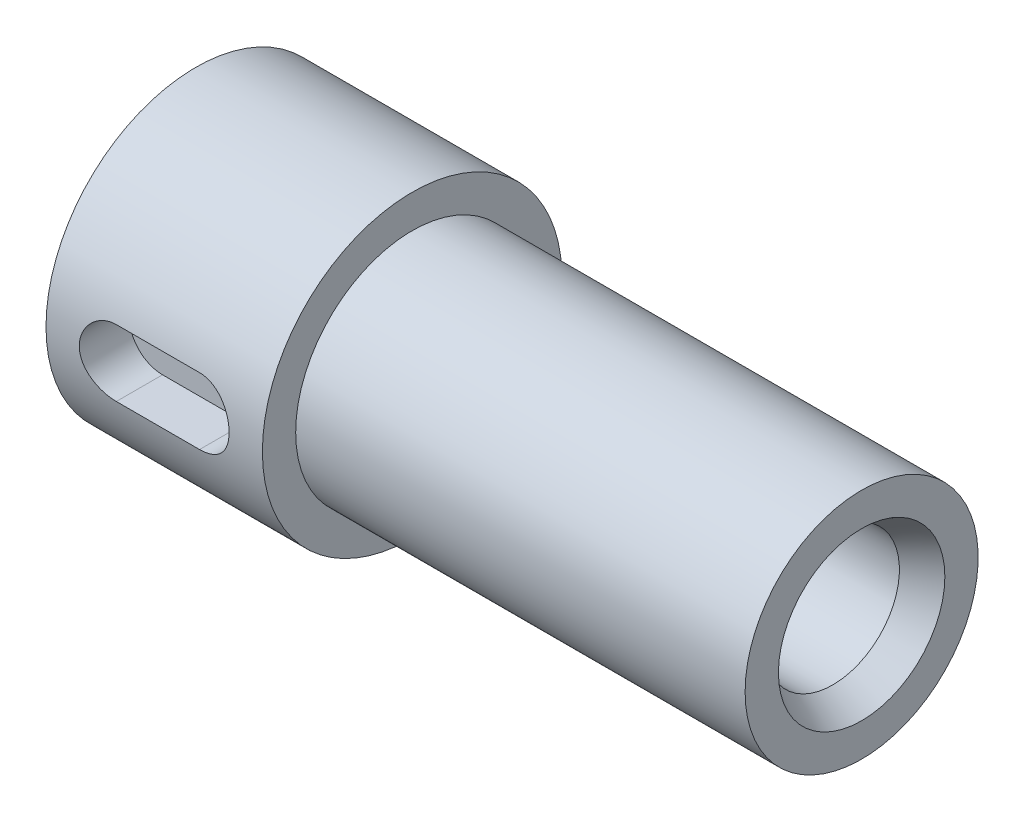
ISO-10303-21;
HEADER;
FILE_DESCRIPTION(('STEP AP214'),'2;1');
FILE_NAME('part.step','',(''),(''),'','','');
FILE_SCHEMA(('AUTOMOTIVE_DESIGN { 1 0 10303 214 1 1 1 1 }'));
ENDSEC;
DATA;
#1=APPLICATION_CONTEXT('core data for automotive mechanical design processes');
#2=APPLICATION_PROTOCOL_DEFINITION('international standard','automotive_design',2000,#1);
#3=PRODUCT_CONTEXT('',#1,'mechanical');
#4=PRODUCT('Part','Part','',(#3));
#5=PRODUCT_RELATED_PRODUCT_CATEGORY('part','',(#4));
#6=PRODUCT_DEFINITION_FORMATION('','',#4);
#7=PRODUCT_DEFINITION_CONTEXT('part definition',#1,'design');
#8=PRODUCT_DEFINITION('design','',#6,#7);
#9=PRODUCT_DEFINITION_SHAPE('','',#8);
#10=(LENGTH_UNIT() NAMED_UNIT(*) SI_UNIT(.MILLI.,.METRE.));
#11=(NAMED_UNIT(*) PLANE_ANGLE_UNIT() SI_UNIT($,.RADIAN.));
#12=(NAMED_UNIT(*) SI_UNIT($,.STERADIAN.) SOLID_ANGLE_UNIT());
#13=UNCERTAINTY_MEASURE_WITH_UNIT(LENGTH_MEASURE(1.E-05),#10,'distance_accuracy_value','');
#14=(GEOMETRIC_REPRESENTATION_CONTEXT(3) GLOBAL_UNCERTAINTY_ASSIGNED_CONTEXT((#13)) GLOBAL_UNIT_ASSIGNED_CONTEXT((#10,
#11,#12)) REPRESENTATION_CONTEXT('',''));
#15=CARTESIAN_POINT('',(0.,0.,0.));
#16=DIRECTION('',(0.,0.,1.));
#17=DIRECTION('',(1.,0.,0.));
#18=AXIS2_PLACEMENT_3D('',#15,#16,#17);
#19=CARTESIAN_POINT('',(0.,5.,0.));
#20=DIRECTION('',(1.,0.,0.));
#21=DIRECTION('',(0.,0.,-1.));
#22=AXIS2_PLACEMENT_3D('',#19,#20,#21);
#23=PLANE('',#22);
#24=CARTESIAN_POINT('',(0.,0.,0.));
#25=DIRECTION('',(-1.,0.,0.));
#26=DIRECTION('',(0.,0.,1.));
#27=AXIS2_PLACEMENT_3D('',#24,#25,#26);
#28=CIRCLE('',#27,5.);
#29=CARTESIAN_POINT('',(0.,0.,5.));
#30=VERTEX_POINT('',#29);
#31=EDGE_CURVE('E139',#30,#30,#28,.T.);
#32=ORIENTED_EDGE('',*,*,#31,.F.);
#33=EDGE_LOOP('',(#32));
#34=FACE_BOUND('',#33,.T.);
#35=CARTESIAN_POINT('',(0.,0.,0.));
#36=DIRECTION('',(-1.,0.,0.));
#37=DIRECTION('',(0.,0.,1.));
#38=AXIS2_PLACEMENT_3D('',#35,#36,#37);
#39=CIRCLE('',#38,9.);
#40=CARTESIAN_POINT('',(0.,0.,9.));
#41=VERTEX_POINT('',#40);
#42=EDGE_CURVE('E175',#41,#41,#39,.T.);
#43=ORIENTED_EDGE('',*,*,#42,.T.);
#44=EDGE_LOOP('',(#43));
#45=FACE_BOUND('',#44,.T.);
#46=ADVANCED_FACE('F45',(#34,#45),#23,.F.);
#47=CARTESIAN_POINT('',(-23.3569219883822,0.,0.));
#48=DIRECTION('',(-1.,0.,0.));
#49=DIRECTION('',(0.,0.,1.));
#50=AXIS2_PLACEMENT_3D('',#47,#48,#49);
#51=CYLINDRICAL_SURFACE('',#50,9.);
#52=CARTESIAN_POINT('',(1.75833325536159,-2.14292396089153,-8.74115993153714));
#53=CARTESIAN_POINT('',(1.91188925583367,-2.26148327559426,-8.71209627188879));
#54=CARTESIAN_POINT('',(2.0763003689229,-2.36665921541542,-8.6837679993605));
#55=CARTESIAN_POINT('',(2.42111145111499,-2.54891187907728,-8.63203868608792));
#56=CARTESIAN_POINT('',(2.60155974831889,-2.62589982629616,-8.608653308841));
#57=CARTESIAN_POINT('',(2.97406287405361,-2.75096916279531,-8.56950957572126));
#58=CARTESIAN_POINT('',(3.16617214374473,-2.79890130458627,-8.55379067864858));
#59=CARTESIAN_POINT('',(3.55583528421908,-2.86452531710483,-8.53203967543747));
#60=CARTESIAN_POINT('',(3.7533845555291,-2.88224198260962,-8.52599962709561));
#61=CARTESIAN_POINT('',(4.1564867882038,-2.88733647052554,-8.52427796279432));
#62=CARTESIAN_POINT('',(4.36205766833457,-2.87353150975853,-8.52900016541797));
#63=CARTESIAN_POINT('',(4.7679136276992,-2.81333602787432,-8.54904239202166));
#64=CARTESIAN_POINT('',(4.96819670738671,-2.76693335820623,-8.5643663670499));
#65=CARTESIAN_POINT('',(5.35786606668187,-2.6421733800478,-8.60367266678249));
#66=CARTESIAN_POINT('',(5.54724289250433,-2.5637888108962,-8.62766237596101));
#67=CARTESIAN_POINT('',(5.90924644812142,-2.37592236980096,-8.6812732764871));
#68=CARTESIAN_POINT('',(6.08186496486539,-2.26642535220534,-8.71089720826652));
#69=CARTESIAN_POINT('',(6.39921938212463,-2.02116158582223,-8.7709966264416));
#70=CARTESIAN_POINT('',(6.54461436645699,-1.88624084930456,-8.80142312488864));
#71=CARTESIAN_POINT('',(6.80630945836137,-1.59023987463746,-8.85966638393269));
#72=CARTESIAN_POINT('',(6.92267456436015,-1.42921943349234,-8.88748888596807));
#73=CARTESIAN_POINT('',(7.09032172911989,-1.1346399141352,-8.92905089652476));
#74=CARTESIAN_POINT('',(7.15069752889299,-1.00647065905311,-8.94454027564996));
#75=CARTESIAN_POINT('',(7.24982617675971,-0.74153073937674,-8.97038342542183));
#76=CARTESIAN_POINT('',(7.28859712763936,-0.604767383072859,-8.98074149480239));
#77=CARTESIAN_POINT('',(7.34237135980943,-0.325711753990555,-8.9951926599674));
#78=CARTESIAN_POINT('',(7.35728034749992,-0.183399811629303,-8.99926089853954));
#79=CARTESIAN_POINT('',(7.36203724693521,0.101680920708592,-9.00055360119157));
#80=CARTESIAN_POINT('',(7.35188675666207,0.244449680975271,-8.99777850165451));
#81=CARTESIAN_POINT('',(7.30866366043605,0.516747809595217,-8.98612134770257));
#82=CARTESIAN_POINT('',(7.27710026141727,0.646539590229844,-8.97764166931983));
#83=CARTESIAN_POINT('',(7.1943510641809,0.89923966655062,-8.95586235240603));
#84=CARTESIAN_POINT('',(7.14316194635,1.02214679369159,-8.94256189848049));
#85=CARTESIAN_POINT('',(7.02014747632733,1.26523401330787,-8.91151143721175));
#86=CARTESIAN_POINT('',(6.94733528857277,1.38488504607174,-8.89355560747465));
#87=CARTESIAN_POINT('',(6.78531701470174,1.61203740337076,-8.85520366907802));
#88=CARTESIAN_POINT('',(6.69610350647156,1.71953319156203,-8.83480645708029));
#89=CARTESIAN_POINT('',(6.48969372130638,1.93628500493332,-8.79004052171071));
#90=CARTESIAN_POINT('',(6.37030908844286,2.04342628698857,-8.76553222208635));
#91=CARTESIAN_POINT('',(6.1170954900999,2.23927563762538,-8.71755858719134));
#92=CARTESIAN_POINT('',(5.98325762984667,2.32797225567665,-8.69409390686687));
#93=CARTESIAN_POINT('',(5.68262828519094,2.49857951712768,-8.64674138014602));
#94=CARTESIAN_POINT('',(5.51394468199514,2.57730644128964,-8.62335187318785));
#95=CARTESIAN_POINT('',(5.16594153076588,2.70854883689283,-8.58303455692452));
#96=CARTESIAN_POINT('',(4.98661806071184,2.7610545747915,-8.56610914769881));
#97=CARTESIAN_POINT('',(4.60634190610235,2.8425028183176,-8.53945028845981));
#98=CARTESIAN_POINT('',(4.40483372542499,2.86911071945456,-8.53043568244742));
#99=CARTESIAN_POINT('',(3.99995507467814,2.89037242349216,-8.52325464914076));
#100=CARTESIAN_POINT('',(3.79658449188051,2.88502427921015,-8.52508888290045));
#101=CARTESIAN_POINT('',(3.39073895693245,2.84216725153015,-8.53947314548294));
#102=CARTESIAN_POINT('',(3.18831672692417,2.8042076009808,-8.55217335731852));
#103=CARTESIAN_POINT('',(2.79297081580028,2.69608239512659,-8.58687007959057));
#104=CARTESIAN_POINT('',(2.60005202984891,2.62590043046981,-8.60887132616612));
#105=CARTESIAN_POINT('',(2.2301103569024,2.4544842419347,-8.65929857481296));
#106=CARTESIAN_POINT('',(2.05304221140792,2.35334232780968,-8.68770541263615));
#107=CARTESIAN_POINT('',(1.72036773621613,2.12104857138793,-8.74731182908649));
#108=CARTESIAN_POINT('',(1.56473747551387,1.98993063343339,-8.77850822849513));
#109=CARTESIAN_POINT('',(1.31365516989232,1.73202856721591,-8.83251480966215));
#110=CARTESIAN_POINT('',(1.21252716676674,1.61082426178729,-8.85564110429793));
#111=CARTESIAN_POINT('',(1.03137188335381,1.35297758400223,-8.89867889646532));
#112=CARTESIAN_POINT('',(0.951331291992842,1.21634502866907,-8.91859241891283));
#113=CARTESIAN_POINT('',(0.815994872071757,0.929292927898268,-8.95306777969438));
#114=CARTESIAN_POINT('',(0.760888352438434,0.778778018221064,-8.9675885299273));
#115=CARTESIAN_POINT('',(0.680178766689468,0.469514966187441,-8.98907499277886));
#116=CARTESIAN_POINT('',(0.654548649862884,0.310774512537897,-8.9960476320086));
#117=CARTESIAN_POINT('',(0.636063062611368,0.0120112048836093,-9.00106937182501));
#118=CARTESIAN_POINT('',(0.639387416248763,-0.12776858316566,-9.00015868530705));
#119=CARTESIAN_POINT('',(0.669624004534528,-0.40452176718807,-8.9919692319703));
#120=CARTESIAN_POINT('',(0.696530890963053,-0.541495792265256,-8.98469190902471));
#121=CARTESIAN_POINT('',(0.770876710003022,-0.803737800758477,-8.96497015086287));
#122=CARTESIAN_POINT('',(0.817514852240793,-0.929251682867247,-8.95272794294313));
#123=CARTESIAN_POINT('',(0.928915715765842,-1.171502604322,-8.92426373509219));
#124=CARTESIAN_POINT('',(0.993691212482553,-1.28823338330634,-8.90803893093235));
#125=CARTESIAN_POINT('',(1.14610192018282,-1.52217606529092,-8.8712110222053));
#126=CARTESIAN_POINT('',(1.23537440899097,-1.63827093737495,-8.8503324431217));
#127=CARTESIAN_POINT('',(1.42950685158114,-1.85600876762425,-8.80724409863128));
#128=CARTESIAN_POINT('',(1.5343458641296,-1.95767078793829,-8.78503614519046));
#129=CARTESIAN_POINT('',(1.68240154392511,-2.08294348133556,-8.7557051798239));
#130=CARTESIAN_POINT('',(1.72002968549345,-2.1133500922034,-8.74840967700161));
#131=CARTESIAN_POINT('',(1.75833325536159,-2.14292396089153,-8.74115993153714));
#132=B_SPLINE_CURVE_WITH_KNOTS('',3,(#52,#53,#54,#55,#56,#57,#58,#59,#60,#61,#62,#63,#64,#65,
#66,#67,#68,#69,#70,#71,#72,#73,#74,#75,#76,#77,#78,#79,#80,#81,#82,#83,#84,#85,#86,#87,#88,#89,
#90,#91,#92,#93,#94,#95,#96,#97,#98,#99,#100,#101,#102,#103,#104,#105,#106,#107,#108,#109,#110,
#111,#112,#113,#114,#115,#116,#117,#118,#119,#120,#121,#122,#123,#124,#125,#126,#127,#128,#129,
#130,#131),.UNSPECIFIED.,.T.,.F.,(4,2,2,2,2,2,2,2,2,2,2,2,2,2,2,2,2,2,2,2,2,2,2,2,2,2,2,2,2,2,2,
2,2,2,2,2,2,2,2,4),(0.,0.588366491328109,1.17857038933175,1.77178078073522,2.3645041498911,
2.97983189325426,3.5953890793953,4.21147205260222,4.82785545256052,5.42651307214421,
6.02381800707726,6.44962159245994,6.87506785682788,7.30219121217525,7.72928733160694,
8.12903845304253,8.52885722066378,8.95084454050468,9.37302329505726,9.85797411606963,
10.3432251038467,10.9037035386571,11.4643898737908,12.0719107107321,12.6794685662119,
13.2955619358445,13.9119694022733,14.5265566090221,15.1404520969251,15.6171555927479,
16.0935574526129,16.5735180198928,17.0530377714839,17.4703554338164,17.8875784782692,
18.2892852056969,18.6912755986404,19.1334269588619,19.5749888051622,19.7217530927145),.UNSPECIFIED.);
#133=CARTESIAN_POINT('',(1.75833325536159,-2.14292396089153,-8.74115993153714));
#134=VERTEX_POINT('',#133);
#135=EDGE_CURVE('E11',#134,#134,#132,.T.);
#136=ORIENTED_EDGE('',*,*,#135,.T.);
#137=EDGE_LOOP('',(#136));
#138=FACE_BOUND('',#137,.T.);
#139=DIRECTION('',(-1.,0.,0.));
#140=VECTOR('',#139,1.);
#141=CARTESIAN_POINT('',(-23.3569219883822,2.,8.77496438739212));
#142=LINE('',#141,#140);
#143=CARTESIAN_POINT('',(4.,2.,8.77496438739212));
#144=VERTEX_POINT('',#143);
#145=CARTESIAN_POINT('',(9.,2.,8.77496438739212));
#146=VERTEX_POINT('',#145);
#147=EDGE_CURVE('E57',#144,#146,#142,.F.);
#148=ORIENTED_EDGE('',*,*,#147,.T.);
#149=CARTESIAN_POINT('',(9.,2.,8.77496438739212));
#150=CARTESIAN_POINT('',(9.05552514647361,2.00000045459512,8.77496115640034));
#151=CARTESIAN_POINT('',(9.11102298474512,1.99768624944103,8.77549207584912));
#152=CARTESIAN_POINT('',(9.22160754178049,1.98845937411262,8.77758865304998));
#153=CARTESIAN_POINT('',(9.27669431784451,1.98154735743532,8.77915416375314));
#154=CARTESIAN_POINT('',(9.44054306407064,1.95400762017603,8.78534175721998));
#155=CARTESIAN_POINT('',(9.54818536469855,1.92657583620863,8.79145524574102));
#156=CARTESIAN_POINT('',(9.75718934192003,1.85442890808307,8.80695386197933));
#157=CARTESIAN_POINT('',(9.85855085705957,1.80971331984064,8.81633907375855));
#158=CARTESIAN_POINT('',(10.0523726932893,1.70431160656546,8.83731858728191));
#159=CARTESIAN_POINT('',(10.1448314742125,1.6436227249196,8.84891327023316));
#160=CARTESIAN_POINT('',(10.3197805511644,1.50688367246421,8.87322853498742));
#161=CARTESIAN_POINT('',(10.402093755033,1.4306095964124,8.88596380452778));
#162=CARTESIAN_POINT('',(10.5528770661474,1.26534059716698,8.91099808649458));
#163=CARTESIAN_POINT('',(10.6213450042461,1.17634368440047,8.92329703031307));
#164=CARTESIAN_POINT('',(10.7431924634024,0.98696143799893,8.94623322919261));
#165=CARTESIAN_POINT('',(10.7964000694536,0.886462933944573,8.95685099014158));
#166=CARTESIAN_POINT('',(10.8851016409907,0.677680651993802,8.97506064392737));
#167=CARTESIAN_POINT('',(10.9205985854612,0.56939818689005,8.98265304559509));
#168=CARTESIAN_POINT('',(10.9723131458297,0.349972042707733,8.99385278070445));
#169=CARTESIAN_POINT('',(10.9888327350002,0.23890276933789,8.99752246602341));
#170=CARTESIAN_POINT('',(11.0030683194609,0.0155102254995511,9.00067950054334));
#171=CARTESIAN_POINT('',(11.000786104026,-0.0968129246277485,9.00016724771875));
#172=CARTESIAN_POINT('',(10.9777062341623,-0.317436362044324,8.9950654834089));
#173=CARTESIAN_POINT('',(10.9572345634269,-0.425772656175102,8.99054775932266));
#174=CARTESIAN_POINT('',(10.8988770204773,-0.637431676318211,8.97802470899415));
#175=CARTESIAN_POINT('',(10.8609904840198,-0.740754210927917,8.97001924972218));
#176=CARTESIAN_POINT('',(10.7685923943718,-0.940355194441152,8.95130525177461));
#177=CARTESIAN_POINT('',(10.7139578341858,-1.03657475960066,8.94057681784342));
#178=CARTESIAN_POINT('',(10.5897078064752,-1.21859559658287,8.91759236806566));
#179=CARTESIAN_POINT('',(10.5200906630081,-1.3043957012102,8.90533618139019));
#180=CARTESIAN_POINT('',(10.3660897498953,-1.46507502998867,8.88033319867523));
#181=CARTESIAN_POINT('',(10.2814223440611,-1.53968185784836,8.86758151505484));
#182=CARTESIAN_POINT('',(10.1006192889536,-1.67370851020907,8.84326607482464));
#183=CARTESIAN_POINT('',(10.004480510531,-1.73312417692636,8.83170264395353));
#184=CARTESIAN_POINT('',(9.80299870610474,-1.83521144407732,8.81105737294632));
#185=CARTESIAN_POINT('',(9.69762307076571,-1.87782054152505,8.80198483364045));
#186=CARTESIAN_POINT('',(9.48102319573544,-1.94458617194851,8.78747811593031));
#187=CARTESIAN_POINT('',(9.36980793270396,-1.96877018878077,8.78203851993083));
#188=CARTESIAN_POINT('',(9.21472626332578,-1.98890863383753,8.77748610434747));
#189=CARTESIAN_POINT('',(9.17185512772788,-1.99306906058969,8.77654166654745));
#190=CARTESIAN_POINT('',(9.08599591843649,-1.99861139492194,8.77528123553462));
#191=CARTESIAN_POINT('',(9.04300815728077,-1.99999790641594,8.77496420101949));
#192=CARTESIAN_POINT('',(9.,-2.,8.77496438739212));
#193=B_SPLINE_CURVE_WITH_KNOTS('',3,(#149,#150,#151,#152,#153,#154,#155,#156,#157,#158,#159,
#160,#161,#162,#163,#164,#165,#166,#167,#168,#169,#170,#171,#172,#173,#174,#175,#176,#177,#178,
#179,#180,#181,#182,#183,#184,#185,#186,#187,#188,#189,#190,#191,#192),.UNSPECIFIED.,.F.,.F.,(4,
2,2,2,2,2,2,2,2,2,2,2,2,2,2,2,2,2,2,2,2,4),(0.,0.166470862557446,0.332918069301397,
0.664948116500255,0.996986695334743,1.32908261379945,1.66633552403082,2.00364123103555,
2.34460966524673,2.68552072822992,3.02092851188465,3.35630437680571,3.685788356901,
4.01528490532245,4.34726192283298,4.6792760944079,5.01838163392106,5.35757988667772,
5.69802797213281,6.03796722694287,6.16714214541559,6.29610249164693),.UNSPECIFIED.);
#194=CARTESIAN_POINT('',(9.,-2.,8.77496438739212));
#195=VERTEX_POINT('',#194);
#196=EDGE_CURVE('E179',#146,#195,#193,.T.);
#197=ORIENTED_EDGE('',*,*,#196,.T.);
#198=DIRECTION('',(-1.,0.,0.));
#199=VECTOR('',#198,1.);
#200=CARTESIAN_POINT('',(-23.3569219883822,-2.,8.77496438739212));
#201=LINE('',#200,#199);
#202=CARTESIAN_POINT('',(4.,-2.,8.77496438739212));
#203=VERTEX_POINT('',#202);
#204=EDGE_CURVE('E446',#195,#203,#201,.T.);
#205=ORIENTED_EDGE('',*,*,#204,.T.);
#206=CARTESIAN_POINT('',(4.,-2.,8.77496438739212));
#207=CARTESIAN_POINT('',(3.94447485352639,-2.00000045459513,8.77496115640034));
#208=CARTESIAN_POINT('',(3.88897701525488,-1.99768624944103,8.77549207584912));
#209=CARTESIAN_POINT('',(3.77839245821951,-1.98845937411262,8.77758865304998));
#210=CARTESIAN_POINT('',(3.72330568215549,-1.98154735743531,8.77915416375314));
#211=CARTESIAN_POINT('',(3.55945693592936,-1.95400762017603,8.78534175721998));
#212=CARTESIAN_POINT('',(3.45181463530145,-1.92657583620863,8.79145524574102));
#213=CARTESIAN_POINT('',(3.24281065807997,-1.85442890808306,8.80695386197933));
#214=CARTESIAN_POINT('',(3.14144914294043,-1.80971331984064,8.81633907375855));
#215=CARTESIAN_POINT('',(2.94762730671073,-1.70431160656546,8.83731858728191));
#216=CARTESIAN_POINT('',(2.85516852578754,-1.6436227249196,8.84891327023316));
#217=CARTESIAN_POINT('',(2.68021944883557,-1.50688367246421,8.87322853498743));
#218=CARTESIAN_POINT('',(2.59790624496703,-1.4306095964124,8.88596380452778));
#219=CARTESIAN_POINT('',(2.44712293385262,-1.26534059716698,8.91099808649458));
#220=CARTESIAN_POINT('',(2.37865499575387,-1.17634368440047,8.92329703031307));
#221=CARTESIAN_POINT('',(2.25680753659759,-0.986961437998929,8.94623322919261));
#222=CARTESIAN_POINT('',(2.20359993054644,-0.886462933944572,8.95685099014158));
#223=CARTESIAN_POINT('',(2.11489835900931,-0.677680651993801,8.97506064392737));
#224=CARTESIAN_POINT('',(2.07940141453881,-0.56939818689005,8.98265304559509));
#225=CARTESIAN_POINT('',(2.02768685417025,-0.349972042707732,8.99385278070445));
#226=CARTESIAN_POINT('',(2.01116726499982,-0.238902769337889,8.99752246602341));
#227=CARTESIAN_POINT('',(1.99693168053913,-0.0155102254995498,9.00067950054334));
#228=CARTESIAN_POINT('',(1.99921389597398,0.09681292462775,9.00016724771875));
#229=CARTESIAN_POINT('',(2.02229376583767,0.317436362044325,8.9950654834089));
#230=CARTESIAN_POINT('',(2.04276543657314,0.425772656175104,8.99054775932266));
#231=CARTESIAN_POINT('',(2.10112297952274,0.637431676318212,8.97802470899415));
#232=CARTESIAN_POINT('',(2.13900951598024,0.740754210927918,8.97001924972218));
#233=CARTESIAN_POINT('',(2.23140760562822,0.940355194441153,8.95130525177461));
#234=CARTESIAN_POINT('',(2.28604216581424,1.03657475960066,8.94057681784342));
#235=CARTESIAN_POINT('',(2.4102921935248,1.21859559658287,8.91759236806566));
#236=CARTESIAN_POINT('',(2.47990933699192,1.3043957012102,8.90533618139019));
#237=CARTESIAN_POINT('',(2.63391025010465,1.46507502998867,8.88033319867523));
#238=CARTESIAN_POINT('',(2.71857765593891,1.53968185784836,8.86758151505484));
#239=CARTESIAN_POINT('',(2.89938071104644,1.67370851020908,8.84326607482464));
#240=CARTESIAN_POINT('',(2.99551948946904,1.73312417692636,8.83170264395353));
#241=CARTESIAN_POINT('',(3.19700129389526,1.83521144407732,8.81105737294632));
#242=CARTESIAN_POINT('',(3.30237692923429,1.87782054152505,8.80198483364045));
#243=CARTESIAN_POINT('',(3.51897680426456,1.94458617194851,8.78747811593031));
#244=CARTESIAN_POINT('',(3.63019206729604,1.96877018878077,8.78203851993083));
#245=CARTESIAN_POINT('',(3.78527373667422,1.98890863383753,8.77748610434747));
#246=CARTESIAN_POINT('',(3.82814487227212,1.99306906058969,8.77654166654745));
#247=CARTESIAN_POINT('',(3.91400408156351,1.99861139492194,8.77528123553462));
#248=CARTESIAN_POINT('',(3.95699184271923,1.99999790641594,8.77496420101949));
#249=CARTESIAN_POINT('',(4.,2.,8.77496438739212));
#250=B_SPLINE_CURVE_WITH_KNOTS('',3,(#206,#207,#208,#209,#210,#211,#212,#213,#214,#215,#216,
#217,#218,#219,#220,#221,#222,#223,#224,#225,#226,#227,#228,#229,#230,#231,#232,#233,#234,#235,
#236,#237,#238,#239,#240,#241,#242,#243,#244,#245,#246,#247,#248,#249),.UNSPECIFIED.,.F.,.F.,(4,
2,2,2,2,2,2,2,2,2,2,2,2,2,2,2,2,2,2,2,2,4),(0.,0.166470862557448,0.3329180693014,
0.664948116500256,0.996986695334748,1.32908261379945,1.66633552403082,2.00364123103555,
2.34460966524673,2.68552072822992,3.02092851188465,3.35630437680571,3.685788356901,
4.01528490532245,4.34726192283298,4.6792760944079,5.01838163392106,5.35757988667772,
5.69802797213281,6.03796722694287,6.16714214541559,6.29610249164692),.UNSPECIFIED.);
#251=EDGE_CURVE('E71',#203,#144,#250,.T.);
#252=ORIENTED_EDGE('',*,*,#251,.T.);
#253=EDGE_LOOP('',(#148,#197,#205,#252));
#254=FACE_BOUND('',#253,.T.);
#255=ORIENTED_EDGE('',*,*,#42,.F.);
#256=EDGE_LOOP('',(#255));
#257=FACE_BOUND('',#256,.T.);
#258=CARTESIAN_POINT('',(13.,0.,0.));
#259=DIRECTION('',(-1.,0.,0.));
#260=DIRECTION('',(0.,0.,1.));
#261=AXIS2_PLACEMENT_3D('',#258,#259,#260);
#262=CIRCLE('',#261,9.);
#263=CARTESIAN_POINT('',(13.,0.,9.));
#264=VERTEX_POINT('',#263);
#265=EDGE_CURVE('E171',#264,#264,#262,.T.);
#266=ORIENTED_EDGE('',*,*,#265,.T.);
#267=EDGE_LOOP('',(#266));
#268=FACE_BOUND('',#267,.T.);
#269=ADVANCED_FACE('F194',(#138,#254,#257,#268),#51,.T.);
#270=CARTESIAN_POINT('',(13.,9.,0.));
#271=DIRECTION('',(-1.,0.,0.));
#272=DIRECTION('',(0.,0.,1.));
#273=AXIS2_PLACEMENT_3D('',#270,#271,#272);
#274=PLANE('',#273);
#275=ORIENTED_EDGE('',*,*,#265,.F.);
#276=EDGE_LOOP('',(#275));
#277=FACE_BOUND('',#276,.T.);
#278=CARTESIAN_POINT('',(13.,0.,0.));
#279=DIRECTION('',(-1.,0.,0.));
#280=DIRECTION('',(0.,0.,1.));
#281=AXIS2_PLACEMENT_3D('',#278,#279,#280);
#282=CIRCLE('',#281,7.);
#283=CARTESIAN_POINT('',(13.,0.,7.));
#284=VERTEX_POINT('',#283);
#285=EDGE_CURVE('E167',#284,#284,#282,.T.);
#286=ORIENTED_EDGE('',*,*,#285,.T.);
#287=EDGE_LOOP('',(#286));
#288=FACE_BOUND('',#287,.T.);
#289=ADVANCED_FACE('F228',(#277,#288),#274,.F.);
#290=CARTESIAN_POINT('',(-23.3569219883822,0.,0.));
#291=DIRECTION('',(-1.,0.,0.));
#292=DIRECTION('',(0.,0.,1.));
#293=AXIS2_PLACEMENT_3D('',#290,#291,#292);
#294=CYLINDRICAL_SURFACE('',#293,7.);
#295=ORIENTED_EDGE('',*,*,#285,.F.);
#296=EDGE_LOOP('',(#295));
#297=FACE_BOUND('',#296,.T.);
#298=CARTESIAN_POINT('',(40.,0.,0.));
#299=DIRECTION('',(-1.,0.,0.));
#300=DIRECTION('',(0.,0.,1.));
#301=AXIS2_PLACEMENT_3D('',#298,#299,#300);
#302=CIRCLE('',#301,7.);
#303=CARTESIAN_POINT('',(40.,0.,7.));
#304=VERTEX_POINT('',#303);
#305=EDGE_CURVE('E163',#304,#304,#302,.T.);
#306=ORIENTED_EDGE('',*,*,#305,.T.);
#307=EDGE_LOOP('',(#306));
#308=FACE_BOUND('',#307,.T.);
#309=ADVANCED_FACE('F225',(#297,#308),#294,.T.);
#310=CARTESIAN_POINT('',(40.,7.,0.));
#311=DIRECTION('',(-1.,0.,0.));
#312=DIRECTION('',(0.,0.,1.));
#313=AXIS2_PLACEMENT_3D('',#310,#311,#312);
#314=PLANE('',#313);
#315=ORIENTED_EDGE('',*,*,#305,.F.);
#316=EDGE_LOOP('',(#315));
#317=FACE_BOUND('',#316,.T.);
#318=CARTESIAN_POINT('',(40.,0.,0.));
#319=DIRECTION('',(-1.,0.,0.));
#320=DIRECTION('',(0.,0.,1.));
#321=AXIS2_PLACEMENT_3D('',#318,#319,#320);
#322=CIRCLE('',#321,5.00000000000001);
#323=CARTESIAN_POINT('',(40.,0.,5.00000000000001));
#324=VERTEX_POINT('',#323);
#325=EDGE_CURVE('E159',#324,#324,#322,.T.);
#326=ORIENTED_EDGE('',*,*,#325,.T.);
#327=EDGE_LOOP('',(#326));
#328=FACE_BOUND('',#327,.T.);
#329=ADVANCED_FACE('F221',(#317,#328),#314,.F.);
#330=CARTESIAN_POINT('',(38.2679491924311,0.,0.));
#331=DIRECTION('',(1.,0.,0.));
#332=DIRECTION('',(0.,0.,-1.));
#333=AXIS2_PLACEMENT_3D('',#330,#331,#332);
#334=CONICAL_SURFACE('',#333,4.,0.523598775598304);
#335=ORIENTED_EDGE('',*,*,#325,.F.);
#336=EDGE_LOOP('',(#335));
#337=FACE_BOUND('',#336,.T.);
#338=CARTESIAN_POINT('',(38.2679491924311,0.,0.));
#339=DIRECTION('',(-1.,0.,0.));
#340=DIRECTION('',(0.,0.,1.));
#341=AXIS2_PLACEMENT_3D('',#338,#339,#340);
#342=CIRCLE('',#341,4.);
#343=CARTESIAN_POINT('',(38.2679491924311,0.,4.));
#344=VERTEX_POINT('',#343);
#345=EDGE_CURVE('E155',#344,#344,#342,.T.);
#346=ORIENTED_EDGE('',*,*,#345,.T.);
#347=EDGE_LOOP('',(#346));
#348=FACE_BOUND('',#347,.T.);
#349=ADVANCED_FACE('F217',(#337,#348),#334,.F.);
#350=CARTESIAN_POINT('',(-23.3569219883822,0.,0.));
#351=DIRECTION('',(-1.,0.,0.));
#352=DIRECTION('',(0.,0.,1.));
#353=AXIS2_PLACEMENT_3D('',#350,#351,#352);
#354=CYLINDRICAL_SURFACE('',#353,4.);
#355=CARTESIAN_POINT('',(2.2,0.,-4.));
#356=CARTESIAN_POINT('',(2.20000467933397,0.0957257310976465,-3.99999614426328));
#357=CARTESIAN_POINT('',(2.2076811565152,0.191597767661921,-3.99652545445408));
#358=CARTESIAN_POINT('',(2.23807960233239,0.380576653366168,-3.98298685001255));
#359=CARTESIAN_POINT('',(2.26083704469152,0.473676440740112,-3.9729033812621));
#360=CARTESIAN_POINT('',(2.32036661002156,0.654078711762163,-3.94720826059709));
#361=CARTESIAN_POINT('',(2.35708824791164,0.741400764100716,-3.93161653705037));
#362=CARTESIAN_POINT('',(2.44327495667924,0.908546015028107,-3.89638931513806));
#363=CARTESIAN_POINT('',(2.49273731496702,0.988370804906615,-3.87675467771579));
#364=CARTESIAN_POINT('',(2.60594379981014,1.14291333567172,-3.83412363908408));
#365=CARTESIAN_POINT('',(2.67029477956268,1.21715266804188,-3.81100581529509));
#366=CARTESIAN_POINT('',(2.81016191836758,1.35420914201012,-3.7644874659604));
#367=CARTESIAN_POINT('',(2.88568484991544,1.41701930331634,-3.7410867768975));
#368=CARTESIAN_POINT('',(3.05118303567565,1.53315347741006,-3.69507447582435));
#369=CARTESIAN_POINT('',(3.14175112393382,1.58568979703721,-3.67259284862511));
#370=CARTESIAN_POINT('',(3.33158516662454,1.67457061237837,-3.6329325973023));
#371=CARTESIAN_POINT('',(3.43084588111104,1.71092478343471,-3.61575080628709));
#372=CARTESIAN_POINT('',(3.6297545745104,1.76435376560856,-3.5899719509949));
#373=CARTESIAN_POINT('',(3.72909825979604,1.7823552208101,-3.58096510986047));
#374=CARTESIAN_POINT('',(3.92977232045031,1.80144593729298,-3.57140297640661));
#375=CARTESIAN_POINT('',(4.03110126795094,1.80254693696235,-3.57084181805522));
#376=CARTESIAN_POINT('',(4.22286555344757,1.7884953134577,-3.57789370708281));
#377=CARTESIAN_POINT('',(4.31344356538275,1.77483260602336,-3.58475751548689));
#378=CARTESIAN_POINT('',(4.49084958115511,1.7341718875662,-3.60460180814281));
#379=CARTESIAN_POINT('',(4.57767670892868,1.70717077931802,-3.61758371300676));
#380=CARTESIAN_POINT('',(4.74747093230712,1.64006511727895,-3.64850272349828));
#381=CARTESIAN_POINT('',(4.83030621199721,1.59967786367521,-3.66654531580319));
#382=CARTESIAN_POINT('',(4.98837927580868,1.50715060004044,-3.70553830375413));
#383=CARTESIAN_POINT('',(5.06361380722114,1.45500558891749,-3.7264899352813));
#384=CARTESIAN_POINT('',(5.21228053941952,1.33432905179612,-3.77148635442421));
#385=CARTESIAN_POINT('',(5.28477790511678,1.26467952790956,-3.79563079409583));
#386=CARTESIAN_POINT('',(5.41740666972043,1.11401728441309,-3.84254971405777));
#387=CARTESIAN_POINT('',(5.47753414300153,1.03300097119336,-3.86532375783124));
#388=CARTESIAN_POINT('',(5.58541102028252,0.85865867148252,-3.90781142190374));
#389=CARTESIAN_POINT('',(5.63271925246359,0.765029091517059,-3.92740837508371));
#390=CARTESIAN_POINT('',(5.71057437716393,0.57003185416933,-3.96040579031747));
#391=CARTESIAN_POINT('',(5.74113210432299,0.468669247156022,-3.97381025693986));
#392=CARTESIAN_POINT('',(5.78252160529469,0.268840742236438,-3.99212554480445));
#393=CARTESIAN_POINT('',(5.79460408825818,0.170683300320854,-3.99757364521785));
#394=CARTESIAN_POINT('',(5.80250349901364,-0.0264022839676918,-4.00112518628585));
#395=CARTESIAN_POINT('',(5.79832613927381,-0.125330143486534,-3.99923120638826));
#396=CARTESIAN_POINT('',(5.7746619773797,-0.314885117682151,-3.9886497854967));
#397=CARTESIAN_POINT('',(5.75610710270702,-0.405654514501629,-3.98037602557828));
#398=CARTESIAN_POINT('',(5.70557349625573,-0.582660936994363,-3.95834128707698));
#399=CARTESIAN_POINT('',(5.67359314764241,-0.66889741535863,-3.94457964759676));
#400=CARTESIAN_POINT('',(5.59610836307183,-0.837442627558638,-3.91232476482971));
#401=CARTESIAN_POINT('',(5.55021406060684,-0.919545639338523,-3.89369761216339));
#402=CARTESIAN_POINT('',(5.44662892622924,-1.07518043699129,-3.85362888732139));
#403=CARTESIAN_POINT('',(5.38893293431481,-1.14870845149995,-3.83218608554495));
#404=CARTESIAN_POINT('',(5.2578477333272,-1.29149865068724,-3.78656870453125));
#405=CARTESIAN_POINT('',(5.18355706636468,-1.35990988482198,-3.76231462852303));
#406=CARTESIAN_POINT('',(5.02427154887892,-1.48359021338331,-3.71528573593652));
#407=CARTESIAN_POINT('',(4.93927261176591,-1.53885426708002,-3.69251148916081));
#408=CARTESIAN_POINT('',(4.75807040489293,-1.63589501788072,-3.65057841083747));
#409=CARTESIAN_POINT('',(4.66163606797321,-1.67729036092624,-3.63152701818996));
#410=CARTESIAN_POINT('',(4.46202689621708,-1.74285314361877,-3.60052790136954));
#411=CARTESIAN_POINT('',(4.35885898854757,-1.76703799286239,-3.58857300064424));
#412=CARTESIAN_POINT('',(4.1582820703096,-1.79563623194532,-3.57434222892223));
#413=CARTESIAN_POINT('',(4.06114311169895,-1.80157406953898,-3.57132092798745));
#414=CARTESIAN_POINT('',(3.86727148107383,-1.79771412847025,-3.57326614661585));
#415=CARTESIAN_POINT('',(3.770538721399,-1.78791994055283,-3.57823084342101));
#416=CARTESIAN_POINT('',(3.58658574227456,-1.75421876318577,-3.59486173075787));
#417=CARTESIAN_POINT('',(3.49915066959729,-1.73124262769487,-3.60608465000342));
#418=CARTESIAN_POINT('',(3.32939442476206,-1.67282749600899,-3.63354977385213));
#419=CARTESIAN_POINT('',(3.24707474891941,-1.63738487322035,-3.64979343886057));
#420=CARTESIAN_POINT('',(3.08404593444911,-1.55242316410908,-3.686767891922));
#421=CARTESIAN_POINT('',(3.00378577466557,-1.50214155769844,-3.70772103430238));
#422=CARTESIAN_POINT('',(2.85236964264455,-1.38990450199416,-3.75123798062696));
#423=CARTESIAN_POINT('',(2.78121761438234,-1.32794402407097,-3.77380247577004));
#424=CARTESIAN_POINT('',(2.64337390179007,-1.18747704777709,-3.82045170156175));
#425=CARTESIAN_POINT('',(2.5776703550561,-1.10798007724224,-3.84448894967992));
#426=CARTESIAN_POINT('',(2.46042031210788,-0.938258691534526,-3.88939150575056));
#427=CARTESIAN_POINT('',(2.40888032721595,-0.848029369667486,-3.91025535285452));
#428=CARTESIAN_POINT('',(2.3222244765562,-0.660057238747114,-3.94631359976078));
#429=CARTESIAN_POINT('',(2.28694991843985,-0.562398348565746,-3.96156247292916));
#430=CARTESIAN_POINT('',(2.23370953572634,-0.361825473838662,-3.98487136345352));
#431=CARTESIAN_POINT('',(2.21569121789188,-0.258928435982937,-3.99295317731336));
#432=CARTESIAN_POINT('',(2.20447371369758,-0.129468336964034,-3.99798889695217));
#433=CARTESIAN_POINT('',(2.20279769523223,-0.10361201599971,-3.99874171674748));
#434=CARTESIAN_POINT('',(2.20056019709707,-0.0518407077583644,-3.99974779382082));
#435=CARTESIAN_POINT('',(2.19999873268034,-0.0259257196833208,-4.00000104426206));
#436=CARTESIAN_POINT('',(2.2,0.,-4.));
#437=B_SPLINE_CURVE_WITH_KNOTS('',3,(#355,#356,#357,#358,#359,#360,#361,#362,#363,#364,#365,
#366,#367,#368,#369,#370,#371,#372,#373,#374,#375,#376,#377,#378,#379,#380,#381,#382,#383,#384,
#385,#386,#387,#388,#389,#390,#391,#392,#393,#394,#395,#396,#397,#398,#399,#400,#401,#402,#403,
#404,#405,#406,#407,#408,#409,#410,#411,#412,#413,#414,#415,#416,#417,#418,#419,#420,#421,#422,
#423,#424,#425,#426,#427,#428,#429,#430,#431,#432,#433,#434,#435,#436),.UNSPECIFIED.,.T.,.F.,(4,
2,2,2,2,2,2,2,2,2,2,2,2,2,2,2,2,2,2,2,2,2,2,2,2,2,2,2,2,2,2,2,2,2,2,2,2,2,2,2,4),(0.,
0.28707077923629,0.574819219909026,0.861537097877733,1.14819398196072,1.44969271232065,
1.75137496751109,2.0710233871927,2.39048043081739,2.69286202607249,2.9950335895199,
3.26933192333241,3.54369398017965,3.82426477103165,4.1049551268689,4.41375209025166,
4.72264690068948,5.04111110479538,5.35936907459828,5.65494364411917,5.9504143806614,
6.22818822408927,6.50599552952314,6.79244743762267,7.07902485859745,7.38921990760169,
7.69953369678121,8.01778885407885,8.33572161502088,8.62625158731758,8.91671525722953,
9.18882532120881,9.461014609583,9.75081852911882,10.0407475171956,10.3569438873586,
10.6732853781698,10.9864715676499,11.2987019943273,11.3764492689105,11.4541976074859),.UNSPECIFIED.);
#438=CARTESIAN_POINT('',(2.2,0.,-4.));
#439=VERTEX_POINT('',#438);
#440=EDGE_CURVE('E104',#439,#439,#437,.T.);
#441=ORIENTED_EDGE('',*,*,#440,.T.);
#442=EDGE_LOOP('',(#441));
#443=FACE_BOUND('',#442,.T.);
#444=CARTESIAN_POINT('',(10.65,0.,4.));
#445=CARTESIAN_POINT('',(10.6499907827934,0.0884596783632793,3.99999309817074));
#446=CARTESIAN_POINT('',(10.6428439856567,0.177062252057583,3.99703145792172));
#447=CARTESIAN_POINT('',(10.6145088580631,0.35175966983641,3.98547113202551));
#448=CARTESIAN_POINT('',(10.5932834889757,0.437847271996961,3.97685757767607));
#449=CARTESIAN_POINT('',(10.5377051877981,0.604702496902741,3.95491965529936));
#450=CARTESIAN_POINT('',(10.5033963566465,0.685486934491195,3.94161112398211));
#451=CARTESIAN_POINT('',(10.4228052421506,0.840076633223486,3.91158286286531));
#452=CARTESIAN_POINT('',(10.3765267188298,0.913884076117565,3.89486420463245));
#453=CARTESIAN_POINT('',(10.270893245356,1.05618769598525,3.85876900012149));
#454=CARTESIAN_POINT('',(10.211042329751,1.12429373957476,3.83930654387258));
#455=CARTESIAN_POINT('',(10.081011160341,1.24983574384757,3.80029483347099));
#456=CARTESIAN_POINT('',(10.0108256007882,1.30726618926957,3.78074553976622));
#457=CARTESIAN_POINT('',(9.85803175112829,1.41254826809049,3.74272551686067));
#458=CARTESIAN_POINT('',(9.77498888469348,1.45980781790561,3.72435159658093));
#459=CARTESIAN_POINT('',(9.60126369070982,1.53951358199407,3.69212136090386));
#460=CARTESIAN_POINT('',(9.51058524863699,1.57196727712791,3.67826276509115));
#461=CARTESIAN_POINT('',(9.32865200299817,1.61953738222492,3.65756021871623));
#462=CARTESIAN_POINT('',(9.23762892785693,1.63540371417154,3.65041449103236));
#463=CARTESIAN_POINT('',(9.05395349263472,1.65168918120803,3.64307714795703));
#464=CARTESIAN_POINT('',(8.9613020323707,1.65211659474,3.64288180572738));
#465=CARTESIAN_POINT('',(8.78440111338128,1.6380778077983,3.64921138579605));
#466=CARTESIAN_POINT('',(8.70004184125084,1.62472398487459,3.6552343974104));
#467=CARTESIAN_POINT('',(8.53488971561883,1.58536484231198,3.67247532251837));
#468=CARTESIAN_POINT('',(8.4540975323967,1.55935715587185,3.68369420783859));
#469=CARTESIAN_POINT('',(8.29635489124138,1.49492412942489,3.71031458481431));
#470=CARTESIAN_POINT('',(8.21952126219167,1.45624866973017,3.72579923184191));
#471=CARTESIAN_POINT('',(8.07313976753996,1.36775445443625,3.75918616236907));
#472=CARTESIAN_POINT('',(8.00359475775085,1.31793135478159,3.77708938726885));
#473=CARTESIAN_POINT('',(7.86771359221219,1.20371911924869,3.81509742396095));
#474=CARTESIAN_POINT('',(7.80211804229674,1.13846630094389,3.8352618825369));
#475=CARTESIAN_POINT('',(7.68255532555862,0.997682554866216,3.87426910607353));
#476=CARTESIAN_POINT('',(7.62859077613916,0.922149319847434,3.8931115728953));
#477=CARTESIAN_POINT('',(7.53276522641496,0.760736369737325,3.92787932271737));
#478=CARTESIAN_POINT('',(7.49119971680582,0.674664094072236,3.94373050716791));
#479=CARTESIAN_POINT('',(7.42339697589112,0.495928253552977,3.97016319816606));
#480=CARTESIAN_POINT('',(7.39715144678883,0.403268287372385,3.98074755693754));
#481=CARTESIAN_POINT('',(7.36227049632178,0.220181304317673,3.99492450637935));
#482=CARTESIAN_POINT('',(7.35264082206407,0.129974172308222,3.99891121146315));
#483=CARTESIAN_POINT('',(7.3483079562367,-0.0508474401522219,4.00069746426785));
#484=CARTESIAN_POINT('',(7.35360058689178,-0.141461799500566,3.99849874371344));
#485=CARTESIAN_POINT('',(7.37824526824295,-0.315907755487548,3.98841747083847));
#486=CARTESIAN_POINT('',(7.39690407334009,-0.399855317526685,3.9808153168881));
#487=CARTESIAN_POINT('',(7.44679209633711,-0.563340473329575,3.96098887803091));
#488=CARTESIAN_POINT('',(7.47802290981479,-0.642877505872146,3.94876400644332));
#489=CARTESIAN_POINT('',(7.55318937998089,-0.798061975964475,3.92039728883464));
#490=CARTESIAN_POINT('',(7.59748856175622,-0.873512656660507,3.90414585630856));
#491=CARTESIAN_POINT('',(7.69713393425787,-1.01617847320907,3.86946768187548));
#492=CARTESIAN_POINT('',(7.75248469508984,-1.0833901834211,3.85104004134399));
#493=CARTESIAN_POINT('',(7.87720430481197,-1.21261994292741,3.8124029584454));
#494=CARTESIAN_POINT('',(7.9472838240393,-1.27394364561822,3.79215916493832));
#495=CARTESIAN_POINT('',(8.09707129060853,-1.38414835482505,3.75333928940831));
#496=CARTESIAN_POINT('',(8.17678125994255,-1.43302674162727,3.73476355904109));
#497=CARTESIAN_POINT('',(8.34509537053331,-1.51742282291388,3.70128700339843));
#498=CARTESIAN_POINT('',(8.43380191600806,-1.55275802936534,3.68643724424496));
#499=CARTESIAN_POINT('',(8.61670916597824,-1.60769618165394,3.66281640168181));
#500=CARTESIAN_POINT('',(8.71090539641817,-1.62731175174753,3.65404044124936));
#501=CARTESIAN_POINT('',(8.89443027315807,-1.64901123940268,3.64429559365239));
#502=CARTESIAN_POINT('',(8.98358721945794,-1.65231049364125,3.64278573581524));
#503=CARTESIAN_POINT('',(9.16112847075918,-1.64451485356567,3.64631178238903));
#504=CARTESIAN_POINT('',(9.24951288691937,-1.6334220656173,3.65134672892697));
#505=CARTESIAN_POINT('',(9.4189330712577,-1.59817118006572,3.666904904187));
#506=CARTESIAN_POINT('',(9.50012071142211,-1.57461958437454,3.67717261200251));
#507=CARTESIAN_POINT('',(9.65741452247409,-1.51570599472927,3.70184411206584));
#508=CARTESIAN_POINT('',(9.73351926429761,-1.48034069596893,3.71624906152171));
#509=CARTESIAN_POINT('',(9.8834220382414,-1.3963806225379,3.7486340889516));
#510=CARTESIAN_POINT('',(9.95681407102141,-1.34712443599271,3.76677577854003));
#511=CARTESIAN_POINT('',(10.0946716872643,-1.23771718137822,3.80412864636709));
#512=CARTESIAN_POINT('',(10.1591342627744,-1.17756245772962,3.82334018195057));
#513=CARTESIAN_POINT('',(10.2819941387037,-1.04300738755744,3.86230172013188));
#514=CARTESIAN_POINT('',(10.3396392236055,-0.967900110730179,3.88199359359226));
#515=CARTESIAN_POINT('',(10.4415401595387,-0.808343463182036,3.91832426905579));
#516=CARTESIAN_POINT('',(10.4857898863659,-0.723889843442853,3.9349616732268));
#517=CARTESIAN_POINT('',(10.5586637398347,-0.54941476010963,3.96305691394127));
#518=CARTESIAN_POINT('',(10.5875424253585,-0.459513381649427,3.97459855421812));
#519=CARTESIAN_POINT('',(10.6295110847851,-0.275719229213244,3.99154438775476));
#520=CARTESIAN_POINT('',(10.6426506662455,-0.181839966818032,3.99696786149576));
#521=CARTESIAN_POINT('',(10.64922677033,-0.0584442952271978,3.99968194626838));
#522=CARTESIAN_POINT('',(10.6500030456642,-0.0292299486703388,4.00000228058839));
#523=CARTESIAN_POINT('',(10.65,0.,4.));
#524=B_SPLINE_CURVE_WITH_KNOTS('',3,(#444,#445,#446,#447,#448,#449,#450,#451,#452,#453,#454,
#455,#456,#457,#458,#459,#460,#461,#462,#463,#464,#465,#466,#467,#468,#469,#470,#471,#472,#473,
#474,#475,#476,#477,#478,#479,#480,#481,#482,#483,#484,#485,#486,#487,#488,#489,#490,#491,#492,
#493,#494,#495,#496,#497,#498,#499,#500,#501,#502,#503,#504,#505,#506,#507,#508,#509,#510,#511,
#512,#513,#514,#515,#516,#517,#518,#519,#520,#521,#522,#523),.UNSPECIFIED.,.T.,.F.,(4,2,2,2,2,2,
2,2,2,2,2,2,2,2,2,2,2,2,2,2,2,2,2,2,2,2,2,2,2,2,2,2,2,2,2,2,2,2,2,4),(0.,0.265297098770621,
0.53129493790666,0.796403981498879,1.06142984766523,1.33841878994456,1.61555043582129,
1.90598404924538,2.19627075414925,2.47277648539421,2.7491339503796,3.00480633611683,
3.26052656166861,3.52163539301341,3.78284615202015,4.06565185095456,4.3485211252851,
4.63767392136376,4.92666995726768,5.19768149557686,5.46861716672806,5.72643264660555,
5.98428085748385,6.25011488704507,6.51605907418433,6.80064580250403,7.08529238632159,
7.37364985225782,7.66177550895677,7.92807823226725,8.19434198489786,8.44869772098561,
8.70312467109946,8.97267479984711,9.24231550885214,9.53104085816543,9.81989801073179,
10.1038095613048,10.3868238858899,10.4744866574818),.UNSPECIFIED.);
#525=CARTESIAN_POINT('',(10.65,0.,4.));
#526=VERTEX_POINT('',#525);
#527=EDGE_CURVE('E412',#526,#526,#524,.T.);
#528=ORIENTED_EDGE('',*,*,#527,.T.);
#529=EDGE_LOOP('',(#528));
#530=FACE_BOUND('',#529,.T.);
#531=ORIENTED_EDGE('',*,*,#345,.F.);
#532=EDGE_LOOP('',(#531));
#533=FACE_BOUND('',#532,.T.);
#534=CARTESIAN_POINT('',(0.577350269189626,0.,0.));
#535=DIRECTION('',(-1.,0.,0.));
#536=DIRECTION('',(0.,0.,1.));
#537=AXIS2_PLACEMENT_3D('',#534,#535,#536);
#538=CIRCLE('',#537,4.);
#539=CARTESIAN_POINT('',(0.577350269189626,0.,4.));
#540=VERTEX_POINT('',#539);
#541=EDGE_CURVE('E151',#540,#540,#538,.T.);
#542=ORIENTED_EDGE('',*,*,#541,.T.);
#543=EDGE_LOOP('',(#542));
#544=FACE_BOUND('',#543,.T.);
#545=ADVANCED_FACE('F213',(#443,#530,#533,#544),#354,.F.);
#546=CARTESIAN_POINT('',(0.,0.,0.));
#547=DIRECTION('',(-1.,0.,0.));
#548=DIRECTION('',(0.,0.,1.));
#549=AXIS2_PLACEMENT_3D('',#546,#547,#548);
#550=CONICAL_SURFACE('',#549,5.,1.0471975511966);
#551=ORIENTED_EDGE('',*,*,#541,.F.);
#552=EDGE_LOOP('',(#551));
#553=FACE_BOUND('',#552,.T.);
#554=ORIENTED_EDGE('',*,*,#31,.T.);
#555=EDGE_LOOP('',(#554));
#556=FACE_BOUND('',#555,.T.);
#557=ADVANCED_FACE('F210',(#553,#556),#550,.F.);
#558=CARTESIAN_POINT('',(4.,0.,6.));
#559=DIRECTION('',(0.,0.,1.));
#560=DIRECTION('',(1.,0.,0.));
#561=AXIS2_PLACEMENT_3D('',#558,#559,#560);
#562=CYLINDRICAL_SURFACE('',#561,2.);
#563=DIRECTION('',(0.,0.,1.));
#564=VECTOR('',#563,1.);
#565=CARTESIAN_POINT('',(4.,-2.,6.));
#566=LINE('',#565,#564);
#567=CARTESIAN_POINT('',(4.,-2.,6.));
#568=VERTEX_POINT('',#567);
#569=EDGE_CURVE('E135',#568,#203,#566,.T.);
#570=ORIENTED_EDGE('',*,*,#569,.F.);
#571=CARTESIAN_POINT('',(4.,0.,6.));
#572=DIRECTION('',(0.,0.,1.));
#573=DIRECTION('',(1.,0.,0.));
#574=AXIS2_PLACEMENT_3D('',#571,#572,#573);
#575=CIRCLE('',#574,2.);
#576=CARTESIAN_POINT('',(4.,2.,6.));
#577=VERTEX_POINT('',#576);
#578=EDGE_CURVE('E121',#577,#568,#575,.T.);
#579=ORIENTED_EDGE('',*,*,#578,.F.);
#580=DIRECTION('',(0.,0.,1.));
#581=VECTOR('',#580,1.);
#582=CARTESIAN_POINT('',(4.,2.,6.));
#583=LINE('',#582,#581);
#584=EDGE_CURVE('E136',#577,#144,#583,.T.);
#585=ORIENTED_EDGE('',*,*,#584,.T.);
#586=ORIENTED_EDGE('',*,*,#251,.F.);
#587=EDGE_LOOP('',(#570,#579,#585,#586));
#588=FACE_BOUND('',#587,.T.);
#589=ADVANCED_FACE('F206',(#588),#562,.F.);
#590=CARTESIAN_POINT('',(4.,2.,6.));
#591=DIRECTION('',(0.,1.,0.));
#592=DIRECTION('',(0.,0.,1.));
#593=AXIS2_PLACEMENT_3D('',#590,#591,#592);
#594=PLANE('',#593);
#595=ORIENTED_EDGE('',*,*,#584,.F.);
#596=DIRECTION('',(-1.,0.,0.));
#597=VECTOR('',#596,1.);
#598=CARTESIAN_POINT('',(4.,2.,6.));
#599=LINE('',#598,#597);
#600=CARTESIAN_POINT('',(8.68278556148877,2.,6.));
#601=VERTEX_POINT('',#600);
#602=EDGE_CURVE('E128',#601,#577,#599,.T.);
#603=ORIENTED_EDGE('',*,*,#602,.F.);
#604=CARTESIAN_POINT('',(9.,2.,6.));
#605=VERTEX_POINT('',#604);
#606=EDGE_CURVE('E100',#605,#601,#599,.T.);
#607=ORIENTED_EDGE('',*,*,#606,.F.);
#608=DIRECTION('',(0.,0.,1.));
#609=VECTOR('',#608,1.);
#610=CARTESIAN_POINT('',(9.,2.,6.));
#611=LINE('',#610,#609);
#612=EDGE_CURVE('E140',#605,#146,#611,.T.);
#613=ORIENTED_EDGE('',*,*,#612,.T.);
#614=ORIENTED_EDGE('',*,*,#147,.F.);
#615=EDGE_LOOP('',(#595,#603,#607,#613,#614));
#616=FACE_BOUND('',#615,.T.);
#617=ADVANCED_FACE('F202',(#616),#594,.F.);
#618=CARTESIAN_POINT('',(9.,0.,6.));
#619=DIRECTION('',(0.,0.,1.));
#620=DIRECTION('',(1.,0.,0.));
#621=AXIS2_PLACEMENT_3D('',#618,#619,#620);
#622=CYLINDRICAL_SURFACE('',#621,2.);
#623=ORIENTED_EDGE('',*,*,#612,.F.);
#624=CARTESIAN_POINT('',(9.,0.,6.));
#625=DIRECTION('',(0.,0.,1.));
#626=DIRECTION('',(1.,0.,0.));
#627=AXIS2_PLACEMENT_3D('',#624,#625,#626);
#628=CIRCLE('',#627,2.);
#629=CARTESIAN_POINT('',(9.,-2.,6.));
#630=VERTEX_POINT('',#629);
#631=EDGE_CURVE('E126',#630,#605,#628,.T.);
#632=ORIENTED_EDGE('',*,*,#631,.F.);
#633=DIRECTION('',(0.,0.,1.));
#634=VECTOR('',#633,1.);
#635=CARTESIAN_POINT('',(9.,-2.,6.));
#636=LINE('',#635,#634);
#637=EDGE_CURVE('E118',#630,#195,#636,.T.);
#638=ORIENTED_EDGE('',*,*,#637,.T.);
#639=ORIENTED_EDGE('',*,*,#196,.F.);
#640=EDGE_LOOP('',(#623,#632,#638,#639));
#641=FACE_BOUND('',#640,.T.);
#642=ADVANCED_FACE('F197',(#641),#622,.F.);
#643=CARTESIAN_POINT('',(4.,-2.,6.));
#644=DIRECTION('',(0.,-1.,0.));
#645=DIRECTION('',(0.,0.,-1.));
#646=AXIS2_PLACEMENT_3D('',#643,#644,#645);
#647=PLANE('',#646);
#648=ORIENTED_EDGE('',*,*,#637,.F.);
#649=DIRECTION('',(1.,0.,0.));
#650=VECTOR('',#649,1.);
#651=CARTESIAN_POINT('',(4.,-2.,6.));
#652=LINE('',#651,#650);
#653=CARTESIAN_POINT('',(8.68278556148877,-2.,6.));
#654=VERTEX_POINT('',#653);
#655=EDGE_CURVE('E97',#654,#630,#652,.T.);
#656=ORIENTED_EDGE('',*,*,#655,.F.);
#657=EDGE_CURVE('E115',#568,#654,#652,.T.);
#658=ORIENTED_EDGE('',*,*,#657,.F.);
#659=ORIENTED_EDGE('',*,*,#569,.T.);
#660=ORIENTED_EDGE('',*,*,#204,.F.);
#661=EDGE_LOOP('',(#648,#656,#658,#659,#660));
#662=FACE_BOUND('',#661,.T.);
#663=ADVANCED_FACE('F114',(#662),#647,.F.);
#664=CARTESIAN_POINT('',(4.,0.,6.));
#665=DIRECTION('',(0.,0.,1.));
#666=DIRECTION('',(1.,0.,0.));
#667=AXIS2_PLACEMENT_3D('',#664,#665,#666);
#668=PLANE('',#667);
#669=CARTESIAN_POINT('',(9.,0.,6.));
#670=DIRECTION('',(0.,0.,1.));
#671=DIRECTION('',(1.,0.,0.));
#672=AXIS2_PLACEMENT_3D('',#669,#670,#671);
#673=CIRCLE('',#672,2.025);
#674=EDGE_CURVE('E103',#601,#654,#673,.T.);
#675=ORIENTED_EDGE('',*,*,#674,.F.);
#676=ORIENTED_EDGE('',*,*,#602,.T.);
#677=ORIENTED_EDGE('',*,*,#578,.T.);
#678=ORIENTED_EDGE('',*,*,#657,.T.);
#679=EDGE_LOOP('',(#675,#676,#677,#678));
#680=FACE_BOUND('',#679,.T.);
#681=ADVANCED_FACE('F123',(#680),#668,.T.);
#682=CARTESIAN_POINT('',(11.025,0.,6.));
#683=DIRECTION('',(0.,0.,1.));
#684=DIRECTION('',(1.,0.,0.));
#685=AXIS2_PLACEMENT_3D('',#682,#683,#684);
#686=PLANE('',#685);
#687=ORIENTED_EDGE('',*,*,#655,.T.);
#688=ORIENTED_EDGE('',*,*,#631,.T.);
#689=ORIENTED_EDGE('',*,*,#606,.T.);
#690=EDGE_CURVE('E63',#654,#601,#673,.T.);
#691=ORIENTED_EDGE('',*,*,#690,.F.);
#692=EDGE_LOOP('',(#687,#688,#689,#691));
#693=FACE_BOUND('',#692,.T.);
#694=ADVANCED_FACE('F95',(#693),#686,.F.);
#695=CARTESIAN_POINT('',(9.,0.,6.));
#696=DIRECTION('',(0.,0.,1.));
#697=DIRECTION('',(1.,0.,0.));
#698=AXIS2_PLACEMENT_3D('',#695,#696,#697);
#699=CYLINDRICAL_SURFACE('',#698,1.65);
#700=ORIENTED_EDGE('',*,*,#527,.F.);
#701=EDGE_LOOP('',(#700));
#702=FACE_BOUND('',#701,.T.);
#703=CARTESIAN_POINT('',(9.,0.,5.625));
#704=DIRECTION('',(0.,0.,1.));
#705=DIRECTION('',(1.,0.,0.));
#706=AXIS2_PLACEMENT_3D('',#703,#704,#705);
#707=CIRCLE('',#706,1.65);
#708=CARTESIAN_POINT('',(10.65,0.,5.625));
#709=VERTEX_POINT('',#708);
#710=EDGE_CURVE('E111',#709,#709,#707,.T.);
#711=ORIENTED_EDGE('',*,*,#710,.T.);
#712=EDGE_LOOP('',(#711));
#713=FACE_BOUND('',#712,.T.);
#714=ADVANCED_FACE('F298',(#702,#713),#699,.F.);
#715=CARTESIAN_POINT('',(9.,0.,6.));
#716=DIRECTION('',(0.,0.,1.));
#717=DIRECTION('',(1.,0.,0.));
#718=AXIS2_PLACEMENT_3D('',#715,#716,#717);
#719=CONICAL_SURFACE('',#718,2.025,0.785398163397446);
#720=ORIENTED_EDGE('',*,*,#710,.F.);
#721=EDGE_LOOP('',(#720));
#722=FACE_BOUND('',#721,.T.);
#723=ORIENTED_EDGE('',*,*,#674,.T.);
#724=ORIENTED_EDGE('',*,*,#690,.T.);
#725=EDGE_LOOP('',(#723,#724));
#726=FACE_BOUND('',#725,.T.);
#727=ADVANCED_FACE('F106',(#722,#726),#719,.F.);
#728=CARTESIAN_POINT('',(4.,0.,-9.));
#729=DIRECTION('',(0.,0.,-1.));
#730=DIRECTION('',(-1.,0.,0.));
#731=AXIS2_PLACEMENT_3D('',#728,#729,#730);
#732=CONICAL_SURFACE('',#731,3.36,0.785398163397448);
#733=CARTESIAN_POINT('',(4.,0.,-7.44));
#734=DIRECTION('',(0.,0.,-1.));
#735=DIRECTION('',(-1.,0.,0.));
#736=AXIS2_PLACEMENT_3D('',#733,#734,#735);
#737=CIRCLE('',#736,1.8);
#738=CARTESIAN_POINT('',(2.2,0.,-7.44));
#739=VERTEX_POINT('',#738);
#740=EDGE_CURVE('E436',#739,#739,#737,.T.);
#741=ORIENTED_EDGE('',*,*,#740,.F.);
#742=EDGE_LOOP('',(#741));
#743=FACE_BOUND('',#742,.T.);
#744=ORIENTED_EDGE('',*,*,#135,.F.);
#745=EDGE_LOOP('',(#744));
#746=FACE_BOUND('',#745,.T.);
#747=ADVANCED_FACE('F273',(#743,#746),#732,.F.);
#748=CARTESIAN_POINT('',(4.,0.,-9.));
#749=DIRECTION('',(0.,0.,-1.));
#750=DIRECTION('',(-1.,0.,0.));
#751=AXIS2_PLACEMENT_3D('',#748,#749,#750);
#752=CYLINDRICAL_SURFACE('',#751,1.8);
#753=ORIENTED_EDGE('',*,*,#440,.F.);
#754=EDGE_LOOP('',(#753));
#755=FACE_BOUND('',#754,.T.);
#756=ORIENTED_EDGE('',*,*,#740,.T.);
#757=EDGE_LOOP('',(#756));
#758=FACE_BOUND('',#757,.T.);
#759=ADVANCED_FACE('F278',(#755,#758),#752,.F.);
#760=CLOSED_SHELL('',(#46,#269,#289,#309,#329,#349,#545,#557,#589,#617,#642,#663,#681,#694,#714,
#727,#747,#759));
#761=MANIFOLD_SOLID_BREP('B2',#760);
#762=ADVANCED_BREP_SHAPE_REPRESENTATION('',(#18,#761),#14);
#763=SHAPE_DEFINITION_REPRESENTATION(#9,#762);
ENDSEC;
END-ISO-10303-21;
